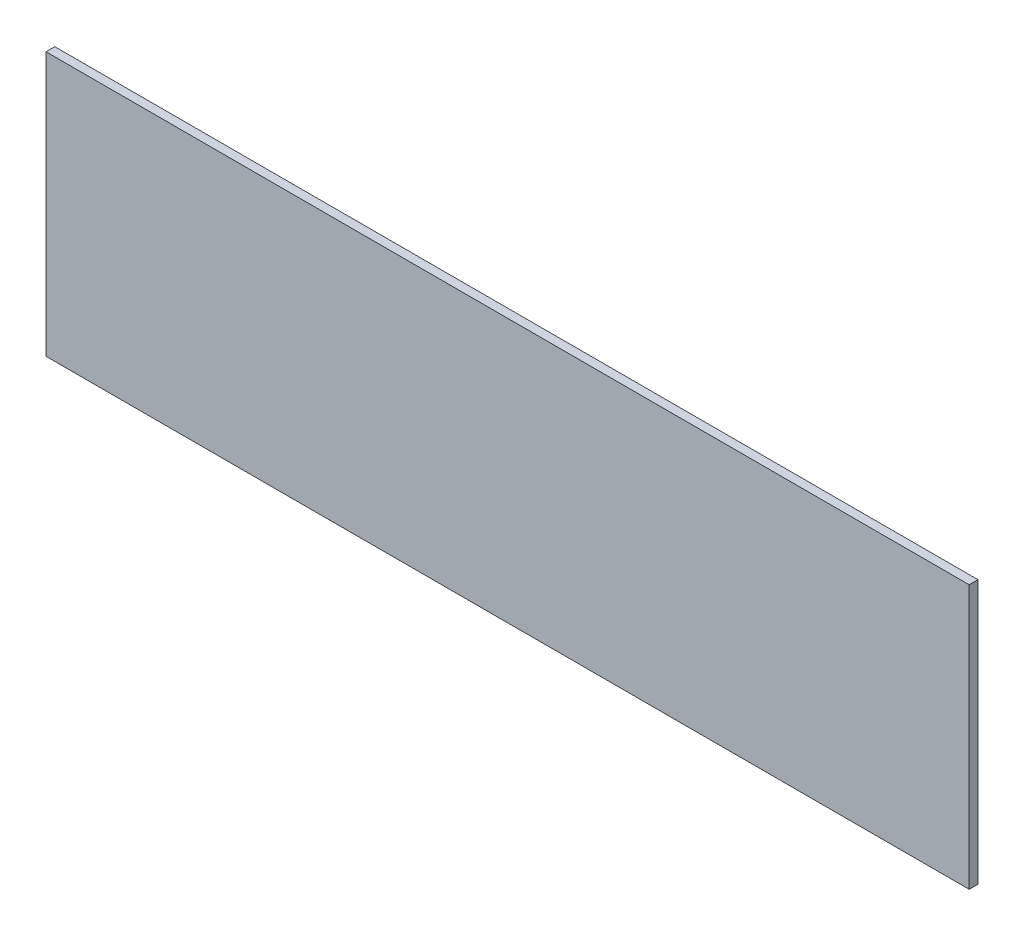
ISO-10303-21;
HEADER;
FILE_DESCRIPTION(('STEP AP214'),'2;1');
FILE_NAME('part.step','',(''),(''),'','','');
FILE_SCHEMA(('AUTOMOTIVE_DESIGN { 1 0 10303 214 1 1 1 1 }'));
ENDSEC;
DATA;
#1=APPLICATION_CONTEXT('core data for automotive mechanical design processes');
#2=APPLICATION_PROTOCOL_DEFINITION('international standard','automotive_design',2000,#1);
#3=PRODUCT_CONTEXT('',#1,'mechanical');
#4=PRODUCT('Part','Part','',(#3));
#5=PRODUCT_RELATED_PRODUCT_CATEGORY('part','',(#4));
#6=PRODUCT_DEFINITION_FORMATION('','',#4);
#7=PRODUCT_DEFINITION_CONTEXT('part definition',#1,'design');
#8=PRODUCT_DEFINITION('design','',#6,#7);
#9=PRODUCT_DEFINITION_SHAPE('','',#8);
#10=(LENGTH_UNIT() NAMED_UNIT(*) SI_UNIT(.MILLI.,.METRE.));
#11=(NAMED_UNIT(*) PLANE_ANGLE_UNIT() SI_UNIT($,.RADIAN.));
#12=(NAMED_UNIT(*) SI_UNIT($,.STERADIAN.) SOLID_ANGLE_UNIT());
#13=UNCERTAINTY_MEASURE_WITH_UNIT(LENGTH_MEASURE(1.E-05),#10,'distance_accuracy_value','');
#14=(GEOMETRIC_REPRESENTATION_CONTEXT(3) GLOBAL_UNCERTAINTY_ASSIGNED_CONTEXT((#13)) GLOBAL_UNIT_ASSIGNED_CONTEXT((#10,
#11,#12)) REPRESENTATION_CONTEXT('',''));
#15=CARTESIAN_POINT('',(0.,0.,0.));
#16=DIRECTION('',(0.,0.,1.));
#17=DIRECTION('',(1.,0.,0.));
#18=AXIS2_PLACEMENT_3D('',#15,#16,#17);
#19=CARTESIAN_POINT('',(52.5,15.,1.));
#20=DIRECTION('',(0.,-1.,0.));
#21=DIRECTION('',(0.,0.,-1.));
#22=AXIS2_PLACEMENT_3D('',#19,#20,#21);
#23=PLANE('',#22);
#24=DIRECTION('',(-1.,0.,0.));
#25=VECTOR('',#24,1.);
#26=CARTESIAN_POINT('',(52.5,15.,0.));
#27=LINE('',#26,#25);
#28=CARTESIAN_POINT('',(52.5,15.,0.));
#29=VERTEX_POINT('',#28);
#30=CARTESIAN_POINT('',(-52.5,15.,0.));
#31=VERTEX_POINT('',#30);
#32=EDGE_CURVE('E113',#29,#31,#27,.T.);
#33=ORIENTED_EDGE('',*,*,#32,.T.);
#34=DIRECTION('',(0.,0.,-1.));
#35=VECTOR('',#34,1.);
#36=CARTESIAN_POINT('',(-52.5,15.,1.));
#37=LINE('',#36,#35);
#38=CARTESIAN_POINT('',(-52.5,15.,1.));
#39=VERTEX_POINT('',#38);
#40=EDGE_CURVE('E11',#39,#31,#37,.T.);
#41=ORIENTED_EDGE('',*,*,#40,.F.);
#42=DIRECTION('',(-1.,0.,0.));
#43=VECTOR('',#42,1.);
#44=CARTESIAN_POINT('',(52.5,15.,1.));
#45=LINE('',#44,#43);
#46=CARTESIAN_POINT('',(52.5,15.,1.));
#47=VERTEX_POINT('',#46);
#48=EDGE_CURVE('E97',#47,#39,#45,.T.);
#49=ORIENTED_EDGE('',*,*,#48,.F.);
#50=DIRECTION('',(0.,0.,-1.));
#51=VECTOR('',#50,1.);
#52=CARTESIAN_POINT('',(52.5,15.,1.));
#53=LINE('',#52,#51);
#54=EDGE_CURVE('E109',#47,#29,#53,.T.);
#55=ORIENTED_EDGE('',*,*,#54,.T.);
#56=EDGE_LOOP('',(#33,#41,#49,#55));
#57=FACE_BOUND('',#56,.T.);
#58=ADVANCED_FACE('F45',(#57),#23,.F.);
#59=CARTESIAN_POINT('',(-52.5,15.,1.));
#60=DIRECTION('',(1.,0.,0.));
#61=DIRECTION('',(0.,0.,-1.));
#62=AXIS2_PLACEMENT_3D('',#59,#60,#61);
#63=PLANE('',#62);
#64=DIRECTION('',(0.,-1.,0.));
#65=VECTOR('',#64,1.);
#66=CARTESIAN_POINT('',(-52.5,15.,0.));
#67=LINE('',#66,#65);
#68=CARTESIAN_POINT('',(-52.5,-15.,0.));
#69=VERTEX_POINT('',#68);
#70=EDGE_CURVE('E102',#31,#69,#67,.T.);
#71=ORIENTED_EDGE('',*,*,#70,.T.);
#72=DIRECTION('',(0.,0.,-1.));
#73=VECTOR('',#72,1.);
#74=CARTESIAN_POINT('',(-52.5,-15.,1.));
#75=LINE('',#74,#73);
#76=CARTESIAN_POINT('',(-52.5,-15.,1.));
#77=VERTEX_POINT('',#76);
#78=EDGE_CURVE('E54',#77,#69,#75,.T.);
#79=ORIENTED_EDGE('',*,*,#78,.F.);
#80=DIRECTION('',(0.,-1.,0.));
#81=VECTOR('',#80,1.);
#82=CARTESIAN_POINT('',(-52.5,15.,1.));
#83=LINE('',#82,#81);
#84=EDGE_CURVE('E92',#39,#77,#83,.T.);
#85=ORIENTED_EDGE('',*,*,#84,.F.);
#86=ORIENTED_EDGE('',*,*,#40,.T.);
#87=EDGE_LOOP('',(#71,#79,#85,#86));
#88=FACE_BOUND('',#87,.T.);
#89=ADVANCED_FACE('F101',(#88),#63,.F.);
#90=CARTESIAN_POINT('',(-52.5,-15.,1.));
#91=DIRECTION('',(0.,1.,0.));
#92=DIRECTION('',(-1.,0.,0.));
#93=AXIS2_PLACEMENT_3D('',#90,#91,#92);
#94=PLANE('',#93);
#95=DIRECTION('',(1.,0.,0.));
#96=VECTOR('',#95,1.);
#97=CARTESIAN_POINT('',(-52.5,-15.,0.));
#98=LINE('',#97,#96);
#99=CARTESIAN_POINT('',(52.5,-15.,0.));
#100=VERTEX_POINT('',#99);
#101=EDGE_CURVE('E79',#69,#100,#98,.T.);
#102=ORIENTED_EDGE('',*,*,#101,.T.);
#103=DIRECTION('',(0.,0.,-1.));
#104=VECTOR('',#103,1.);
#105=CARTESIAN_POINT('',(52.5,-15.,1.));
#106=LINE('',#105,#104);
#107=CARTESIAN_POINT('',(52.5,-15.,1.));
#108=VERTEX_POINT('',#107);
#109=EDGE_CURVE('E104',#108,#100,#106,.T.);
#110=ORIENTED_EDGE('',*,*,#109,.F.);
#111=DIRECTION('',(1.,0.,0.));
#112=VECTOR('',#111,1.);
#113=CARTESIAN_POINT('',(-52.5,-15.,1.));
#114=LINE('',#113,#112);
#115=EDGE_CURVE('E95',#77,#108,#114,.T.);
#116=ORIENTED_EDGE('',*,*,#115,.F.);
#117=ORIENTED_EDGE('',*,*,#78,.T.);
#118=EDGE_LOOP('',(#102,#110,#116,#117));
#119=FACE_BOUND('',#118,.T.);
#120=ADVANCED_FACE('F105',(#119),#94,.F.);
#121=CARTESIAN_POINT('',(52.5,-15.,1.));
#122=DIRECTION('',(-1.,0.,0.));
#123=DIRECTION('',(0.,0.,1.));
#124=AXIS2_PLACEMENT_3D('',#121,#122,#123);
#125=PLANE('',#124);
#126=DIRECTION('',(0.,1.,0.));
#127=VECTOR('',#126,1.);
#128=CARTESIAN_POINT('',(52.5,-15.,0.));
#129=LINE('',#128,#127);
#130=EDGE_CURVE('E85',#100,#29,#129,.T.);
#131=ORIENTED_EDGE('',*,*,#130,.T.);
#132=ORIENTED_EDGE('',*,*,#54,.F.);
#133=DIRECTION('',(0.,1.,0.));
#134=VECTOR('',#133,1.);
#135=CARTESIAN_POINT('',(52.5,-15.,1.));
#136=LINE('',#135,#134);
#137=EDGE_CURVE('E62',#108,#47,#136,.T.);
#138=ORIENTED_EDGE('',*,*,#137,.F.);
#139=ORIENTED_EDGE('',*,*,#109,.T.);
#140=EDGE_LOOP('',(#131,#132,#138,#139));
#141=FACE_BOUND('',#140,.T.);
#142=ADVANCED_FACE('F126',(#141),#125,.F.);
#143=CARTESIAN_POINT('',(0.,0.,1.));
#144=DIRECTION('',(0.,0.,1.));
#145=DIRECTION('',(1.,0.,0.));
#146=AXIS2_PLACEMENT_3D('',#143,#144,#145);
#147=PLANE('',#146);
#148=ORIENTED_EDGE('',*,*,#48,.T.);
#149=ORIENTED_EDGE('',*,*,#84,.T.);
#150=ORIENTED_EDGE('',*,*,#115,.T.);
#151=ORIENTED_EDGE('',*,*,#137,.T.);
#152=EDGE_LOOP('',(#148,#149,#150,#151));
#153=FACE_BOUND('',#152,.T.);
#154=ADVANCED_FACE('F93',(#153),#147,.T.);
#155=CARTESIAN_POINT('',(0.,0.,0.));
#156=DIRECTION('',(0.,0.,1.));
#157=DIRECTION('',(1.,0.,0.));
#158=AXIS2_PLACEMENT_3D('',#155,#156,#157);
#159=PLANE('',#158);
#160=ORIENTED_EDGE('',*,*,#32,.F.);
#161=ORIENTED_EDGE('',*,*,#130,.F.);
#162=ORIENTED_EDGE('',*,*,#101,.F.);
#163=ORIENTED_EDGE('',*,*,#70,.F.);
#164=EDGE_LOOP('',(#160,#161,#162,#163));
#165=FACE_BOUND('',#164,.T.);
#166=ADVANCED_FACE('F129',(#165),#159,.F.);
#167=CLOSED_SHELL('',(#58,#89,#120,#142,#154,#166));
#168=MANIFOLD_SOLID_BREP('B2',#167);
#169=ADVANCED_BREP_SHAPE_REPRESENTATION('',(#18,#168),#14);
#170=SHAPE_DEFINITION_REPRESENTATION(#9,#169);
ENDSEC;
END-ISO-10303-21;
